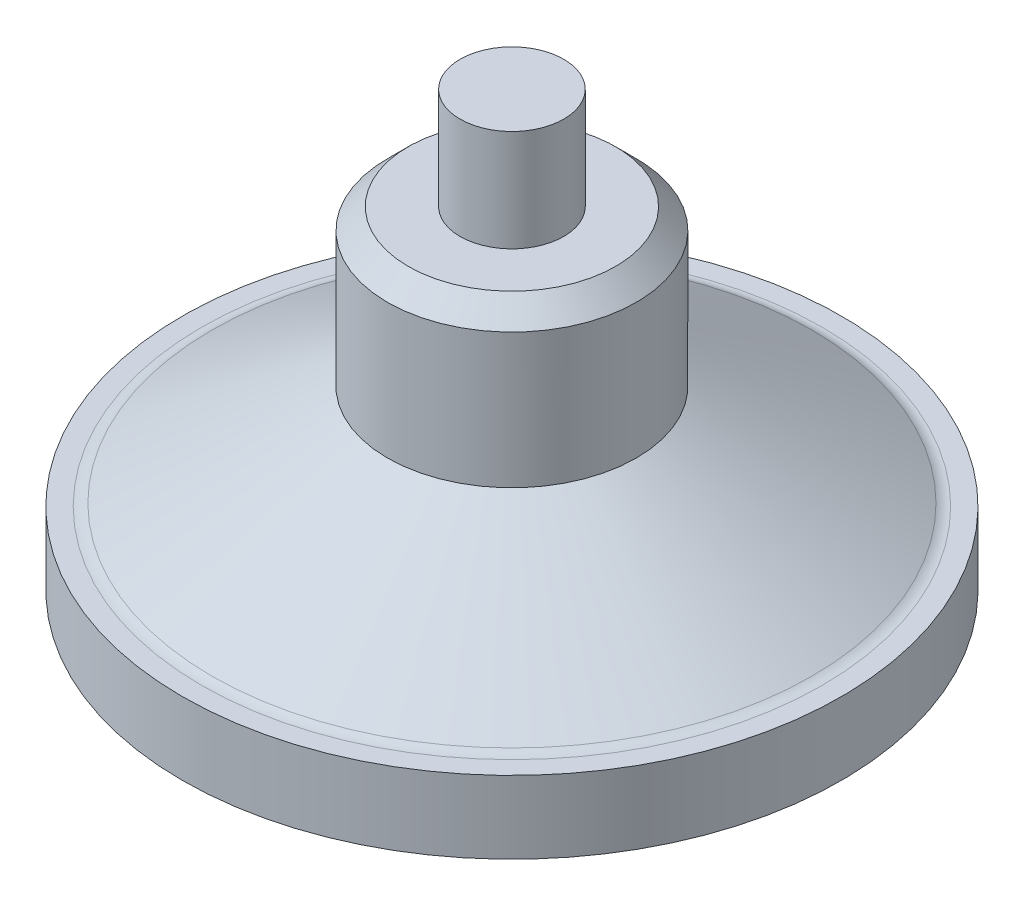
ISO-10303-21;
HEADER;
FILE_DESCRIPTION(('STEP AP214'),'2;1');
FILE_NAME('part.step','',(''),(''),'','','');
FILE_SCHEMA(('AUTOMOTIVE_DESIGN { 1 0 10303 214 1 1 1 1 }'));
ENDSEC;
DATA;
#1=APPLICATION_CONTEXT('core data for automotive mechanical design processes');
#2=APPLICATION_PROTOCOL_DEFINITION('international standard','automotive_design',2000,#1);
#3=PRODUCT_CONTEXT('',#1,'mechanical');
#4=PRODUCT('Part','Part','',(#3));
#5=PRODUCT_RELATED_PRODUCT_CATEGORY('part','',(#4));
#6=PRODUCT_DEFINITION_FORMATION('','',#4);
#7=PRODUCT_DEFINITION_CONTEXT('part definition',#1,'design');
#8=PRODUCT_DEFINITION('design','',#6,#7);
#9=PRODUCT_DEFINITION_SHAPE('','',#8);
#10=(LENGTH_UNIT() NAMED_UNIT(*) SI_UNIT(.MILLI.,.METRE.));
#11=(NAMED_UNIT(*) PLANE_ANGLE_UNIT() SI_UNIT($,.RADIAN.));
#12=(NAMED_UNIT(*) SI_UNIT($,.STERADIAN.) SOLID_ANGLE_UNIT());
#13=UNCERTAINTY_MEASURE_WITH_UNIT(LENGTH_MEASURE(1.E-05),#10,'distance_accuracy_value','');
#14=(GEOMETRIC_REPRESENTATION_CONTEXT(3) GLOBAL_UNCERTAINTY_ASSIGNED_CONTEXT((#13)) GLOBAL_UNIT_ASSIGNED_CONTEXT((#10,
#11,#12)) REPRESENTATION_CONTEXT('',''));
#15=CARTESIAN_POINT('',(0.,0.,0.));
#16=DIRECTION('',(0.,0.,1.));
#17=DIRECTION('',(1.,0.,0.));
#18=AXIS2_PLACEMENT_3D('',#15,#16,#17);
#19=CARTESIAN_POINT('',(0.,31.9758235435502,0.));
#20=DIRECTION('',(0.,1.,0.));
#21=DIRECTION('',(0.,0.,1.));
#22=AXIS2_PLACEMENT_3D('',#19,#20,#21);
#23=CYLINDRICAL_SURFACE('',#22,15.8878221735089);
#24=CARTESIAN_POINT('',(0.,-5.01591647054692,0.));
#25=DIRECTION('',(0.,1.,0.));
#26=DIRECTION('',(0.,0.,1.));
#27=AXIS2_PLACEMENT_3D('',#24,#25,#26);
#28=CIRCLE('',#27,15.8878221735089);
#29=CARTESIAN_POINT('',(0.,-5.01591647054692,15.8878221735089));
#30=VERTEX_POINT('',#29);
#31=EDGE_CURVE('E75',#30,#30,#28,.T.);
#32=ORIENTED_EDGE('',*,*,#31,.T.);
#33=EDGE_LOOP('',(#32));
#34=FACE_BOUND('',#33,.T.);
#35=CARTESIAN_POINT('',(0.,-1.51591647054691,0.));
#36=DIRECTION('',(0.,1.,0.));
#37=DIRECTION('',(0.,0.,1.));
#38=AXIS2_PLACEMENT_3D('',#35,#36,#37);
#39=CIRCLE('',#38,15.8878221735089);
#40=CARTESIAN_POINT('',(0.,-1.51591647054691,15.8878221735089));
#41=VERTEX_POINT('',#40);
#42=EDGE_CURVE('E60',#41,#41,#39,.T.);
#43=ORIENTED_EDGE('',*,*,#42,.F.);
#44=EDGE_LOOP('',(#43));
#45=FACE_BOUND('',#44,.T.);
#46=ADVANCED_FACE('F34',(#34,#45),#23,.T.);
#47=CARTESIAN_POINT('',(0.,-1.51591647054692,0.));
#48=DIRECTION('',(0.,1.,0.));
#49=DIRECTION('',(0.,0.,1.));
#50=AXIS2_PLACEMENT_3D('',#47,#48,#49);
#51=PLANE('',#50);
#52=CARTESIAN_POINT('',(0.,-1.51591647054692,0.));
#53=DIRECTION('',(0.,1.,0.));
#54=DIRECTION('',(0.,0.,1.));
#55=AXIS2_PLACEMENT_3D('',#52,#53,#54);
#56=CIRCLE('',#55,14.9557713659401);
#57=CARTESIAN_POINT('',(0.,-1.51591647054692,14.9557713659401));
#58=VERTEX_POINT('',#57);
#59=EDGE_CURVE('E10',#58,#58,#56,.F.);
#60=ORIENTED_EDGE('',*,*,#59,.T.);
#61=EDGE_LOOP('',(#60));
#62=FACE_BOUND('',#61,.T.);
#63=ORIENTED_EDGE('',*,*,#42,.T.);
#64=EDGE_LOOP('',(#63));
#65=FACE_BOUND('',#64,.T.);
#66=ADVANCED_FACE('F98',(#62,#65),#51,.T.);
#67=CARTESIAN_POINT('',(0.,3.5,0.));
#68=DIRECTION('',(0.,-1.,0.));
#69=DIRECTION('',(0.,0.,-1.));
#70=AXIS2_PLACEMENT_3D('',#67,#68,#69);
#71=CONICAL_SURFACE('',#70,6.,1.0471975511966);
#72=CARTESIAN_POINT('',(0.,-1.38194187433135,0.));
#73=DIRECTION('',(0.,-1.,0.));
#74=DIRECTION('',(0.,0.,-1.));
#75=AXIS2_PLACEMENT_3D('',#72,#73,#74);
#76=CIRCLE('',#75,14.4557713659401);
#77=CARTESIAN_POINT('',(0.,-1.38194187433135,-14.4557713659401));
#78=VERTEX_POINT('',#77);
#79=EDGE_CURVE('E41',#78,#78,#76,.F.);
#80=ORIENTED_EDGE('',*,*,#79,.T.);
#81=EDGE_LOOP('',(#80));
#82=FACE_BOUND('',#81,.T.);
#83=CARTESIAN_POINT('',(0.,3.5,0.));
#84=DIRECTION('',(0.,1.,0.));
#85=DIRECTION('',(0.,0.,1.));
#86=AXIS2_PLACEMENT_3D('',#83,#84,#85);
#87=CIRCLE('',#86,6.);
#88=CARTESIAN_POINT('',(0.,3.5,6.));
#89=VERTEX_POINT('',#88);
#90=EDGE_CURVE('E63',#89,#89,#87,.T.);
#91=ORIENTED_EDGE('',*,*,#90,.F.);
#92=EDGE_LOOP('',(#91));
#93=FACE_BOUND('',#92,.T.);
#94=ADVANCED_FACE('F103',(#82,#93),#71,.T.);
#95=CARTESIAN_POINT('',(0.,31.9758235435502,0.));
#96=DIRECTION('',(0.,1.,0.));
#97=DIRECTION('',(0.,0.,1.));
#98=AXIS2_PLACEMENT_3D('',#95,#96,#97);
#99=CYLINDRICAL_SURFACE('',#98,6.);
#100=CARTESIAN_POINT('',(0.,9.99904522164388,0.));
#101=DIRECTION('',(0.,1.,0.));
#102=DIRECTION('',(0.,0.,1.));
#103=AXIS2_PLACEMENT_3D('',#100,#101,#102);
#104=CIRCLE('',#103,6.);
#105=CARTESIAN_POINT('',(0.,9.99904522164388,6.));
#106=VERTEX_POINT('',#105);
#107=EDGE_CURVE('E45',#106,#106,#104,.F.);
#108=ORIENTED_EDGE('',*,*,#107,.T.);
#109=EDGE_LOOP('',(#108));
#110=FACE_BOUND('',#109,.T.);
#111=ORIENTED_EDGE('',*,*,#90,.T.);
#112=EDGE_LOOP('',(#111));
#113=FACE_BOUND('',#112,.T.);
#114=ADVANCED_FACE('F120',(#110,#113),#99,.T.);
#115=CARTESIAN_POINT('',(0.,10.9990452216439,0.));
#116=DIRECTION('',(0.,1.,0.));
#117=DIRECTION('',(0.,0.,1.));
#118=AXIS2_PLACEMENT_3D('',#115,#116,#117);
#119=PLANE('',#118);
#120=CARTESIAN_POINT('',(0.,10.9990452216439,0.));
#121=DIRECTION('',(0.,1.,0.));
#122=DIRECTION('',(0.,0.,1.));
#123=AXIS2_PLACEMENT_3D('',#120,#121,#122);
#124=CIRCLE('',#123,5.00000000000001);
#125=CARTESIAN_POINT('',(0.,10.9990452216439,5.00000000000001));
#126=VERTEX_POINT('',#125);
#127=EDGE_CURVE('E49',#126,#126,#124,.T.);
#128=ORIENTED_EDGE('',*,*,#127,.T.);
#129=EDGE_LOOP('',(#128));
#130=FACE_BOUND('',#129,.T.);
#131=CARTESIAN_POINT('',(0.,10.9990452216439,0.));
#132=DIRECTION('',(0.,1.,0.));
#133=DIRECTION('',(0.,0.,1.));
#134=AXIS2_PLACEMENT_3D('',#131,#132,#133);
#135=CIRCLE('',#134,2.5);
#136=CARTESIAN_POINT('',(0.,10.9990452216439,2.5));
#137=VERTEX_POINT('',#136);
#138=EDGE_CURVE('E66',#137,#137,#135,.T.);
#139=ORIENTED_EDGE('',*,*,#138,.F.);
#140=EDGE_LOOP('',(#139));
#141=FACE_BOUND('',#140,.T.);
#142=ADVANCED_FACE('F116',(#130,#141),#119,.T.);
#143=CARTESIAN_POINT('',(0.,31.9758235435502,0.));
#144=DIRECTION('',(0.,1.,0.));
#145=DIRECTION('',(0.,0.,1.));
#146=AXIS2_PLACEMENT_3D('',#143,#144,#145);
#147=CYLINDRICAL_SURFACE('',#146,2.5);
#148=CARTESIAN_POINT('',(0.,15.8990452216439,0.));
#149=DIRECTION('',(0.,1.,0.));
#150=DIRECTION('',(0.,0.,1.));
#151=AXIS2_PLACEMENT_3D('',#148,#149,#150);
#152=CIRCLE('',#151,2.5);
#153=CARTESIAN_POINT('',(0.,15.8990452216439,2.5));
#154=VERTEX_POINT('',#153);
#155=EDGE_CURVE('E69',#154,#154,#152,.T.);
#156=ORIENTED_EDGE('',*,*,#155,.F.);
#157=EDGE_LOOP('',(#156));
#158=FACE_BOUND('',#157,.T.);
#159=ORIENTED_EDGE('',*,*,#138,.T.);
#160=EDGE_LOOP('',(#159));
#161=FACE_BOUND('',#160,.T.);
#162=ADVANCED_FACE('F119',(#158,#161),#147,.T.);
#163=CARTESIAN_POINT('',(0.,15.8990452216439,0.));
#164=DIRECTION('',(0.,-1.,0.));
#165=DIRECTION('',(0.,0.,-1.));
#166=AXIS2_PLACEMENT_3D('',#163,#164,#165);
#167=PLANE('',#166);
#168=ORIENTED_EDGE('',*,*,#155,.T.);
#169=EDGE_LOOP('',(#168));
#170=FACE_BOUND('',#169,.T.);
#171=ADVANCED_FACE('F125',(#170),#167,.F.);
#172=CARTESIAN_POINT('',(0.,0.,0.));
#173=DIRECTION('',(0.,-1.,0.));
#174=DIRECTION('',(0.,0.,-1.));
#175=AXIS2_PLACEMENT_3D('',#172,#173,#174);
#176=PLANE('',#175);
#177=CARTESIAN_POINT('',(0.,0.,0.));
#178=DIRECTION('',(0.,1.,0.));
#179=DIRECTION('',(0.,0.,1.));
#180=AXIS2_PLACEMENT_3D('',#177,#178,#179);
#181=CIRCLE('',#180,5.06217782649108);
#182=CARTESIAN_POINT('',(0.,0.,5.06217782649108));
#183=VERTEX_POINT('',#182);
#184=EDGE_CURVE('E72',#183,#183,#181,.T.);
#185=ORIENTED_EDGE('',*,*,#184,.F.);
#186=EDGE_LOOP('',(#185));
#187=FACE_BOUND('',#186,.T.);
#188=ADVANCED_FACE('F94',(#187),#176,.T.);
#189=CARTESIAN_POINT('',(0.,0.,0.));
#190=DIRECTION('',(0.,-1.,0.));
#191=DIRECTION('',(0.,0.,-1.));
#192=AXIS2_PLACEMENT_3D('',#189,#190,#191);
#193=CONICAL_SURFACE('',#192,5.06217782649108,1.0471975511966);
#194=CARTESIAN_POINT('',(0.,-4.61399268190023,0.));
#195=DIRECTION('',(0.,-1.,0.));
#196=DIRECTION('',(0.,0.,-1.));
#197=AXIS2_PLACEMENT_3D('',#194,#195,#196);
#198=CIRCLE('',#197,13.0538475772934);
#199=CARTESIAN_POINT('',(0.,-4.61399268190023,-13.0538475772934));
#200=VERTEX_POINT('',#199);
#201=EDGE_CURVE('E54',#200,#200,#198,.T.);
#202=ORIENTED_EDGE('',*,*,#201,.T.);
#203=EDGE_LOOP('',(#202));
#204=FACE_BOUND('',#203,.T.);
#205=ORIENTED_EDGE('',*,*,#184,.T.);
#206=EDGE_LOOP('',(#205));
#207=FACE_BOUND('',#206,.T.);
#208=ADVANCED_FACE('F84',(#204,#207),#193,.F.);
#209=CARTESIAN_POINT('',(0.,-5.01591647054691,0.));
#210=DIRECTION('',(0.,-1.,0.));
#211=DIRECTION('',(0.,0.,-1.));
#212=AXIS2_PLACEMENT_3D('',#209,#210,#211);
#213=PLANE('',#212);
#214=CARTESIAN_POINT('',(0.,-5.01591647054691,0.));
#215=DIRECTION('',(0.,-1.,0.));
#216=DIRECTION('',(0.,0.,-1.));
#217=AXIS2_PLACEMENT_3D('',#214,#215,#216);
#218=CIRCLE('',#217,14.5538475772934);
#219=CARTESIAN_POINT('',(0.,-5.01591647054691,-14.5538475772934));
#220=VERTEX_POINT('',#219);
#221=EDGE_CURVE('E57',#220,#220,#218,.F.);
#222=ORIENTED_EDGE('',*,*,#221,.T.);
#223=EDGE_LOOP('',(#222));
#224=FACE_BOUND('',#223,.T.);
#225=ORIENTED_EDGE('',*,*,#31,.F.);
#226=EDGE_LOOP('',(#225));
#227=FACE_BOUND('',#226,.T.);
#228=ADVANCED_FACE('F81',(#224,#227),#213,.T.);
#229=CARTESIAN_POINT('',(0.,-2.01591647054691,0.));
#230=DIRECTION('',(0.,-1.,0.));
#231=DIRECTION('',(0.,0.,-1.));
#232=AXIS2_PLACEMENT_3D('',#229,#230,#231);
#233=TOROIDAL_SURFACE('',#232,14.5538475772934,3.);
#234=ORIENTED_EDGE('',*,*,#201,.F.);
#235=EDGE_LOOP('',(#234));
#236=FACE_BOUND('',#235,.T.);
#237=ORIENTED_EDGE('',*,*,#221,.F.);
#238=EDGE_LOOP('',(#237));
#239=FACE_BOUND('',#238,.T.);
#240=ADVANCED_FACE('F83',(#236,#239),#233,.T.);
#241=CARTESIAN_POINT('',(0.,10.9990452216439,0.));
#242=DIRECTION('',(0.,-1.,0.));
#243=DIRECTION('',(0.,0.,-1.));
#244=AXIS2_PLACEMENT_3D('',#241,#242,#243);
#245=CONICAL_SURFACE('',#244,5.00000000000001,0.785398163397449);
#246=ORIENTED_EDGE('',*,*,#107,.F.);
#247=EDGE_LOOP('',(#246));
#248=FACE_BOUND('',#247,.T.);
#249=ORIENTED_EDGE('',*,*,#127,.F.);
#250=EDGE_LOOP('',(#249));
#251=FACE_BOUND('',#250,.T.);
#252=ADVANCED_FACE('F91',(#248,#251),#245,.T.);
#253=CARTESIAN_POINT('',(0.,-0.515916470546916,0.));
#254=DIRECTION('',(0.,1.,0.));
#255=DIRECTION('',(0.,0.,1.));
#256=AXIS2_PLACEMENT_3D('',#253,#254,#255);
#257=TOROIDAL_SURFACE('',#256,14.9557713659401,1.);
#258=ORIENTED_EDGE('',*,*,#59,.F.);
#259=EDGE_LOOP('',(#258));
#260=FACE_BOUND('',#259,.T.);
#261=ORIENTED_EDGE('',*,*,#79,.F.);
#262=EDGE_LOOP('',(#261));
#263=FACE_BOUND('',#262,.T.);
#264=ADVANCED_FACE('F36',(#260,#263),#257,.F.);
#265=CLOSED_SHELL('',(#46,#66,#94,#114,#142,#162,#171,#188,#208,#228,#240,#252,#264));
#266=MANIFOLD_SOLID_BREP('B2',#265);
#267=ADVANCED_BREP_SHAPE_REPRESENTATION('',(#18,#266),#14);
#268=SHAPE_DEFINITION_REPRESENTATION(#9,#267);
ENDSEC;
END-ISO-10303-21;
